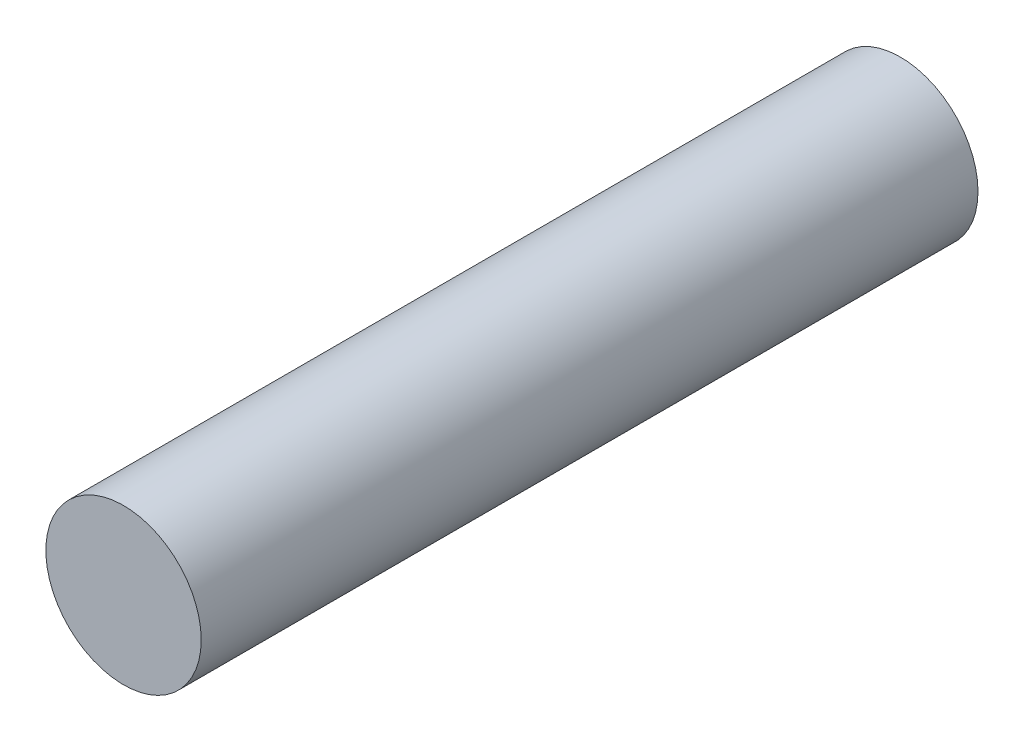
ISO-10303-21;
HEADER;
FILE_DESCRIPTION(('STEP AP214'),'2;1');
FILE_NAME('part.step','',(''),(''),'','','');
FILE_SCHEMA(('AUTOMOTIVE_DESIGN { 1 0 10303 214 1 1 1 1 }'));
ENDSEC;
DATA;
#1=APPLICATION_CONTEXT('core data for automotive mechanical design processes');
#2=APPLICATION_PROTOCOL_DEFINITION('international standard','automotive_design',2000,#1);
#3=PRODUCT_CONTEXT('',#1,'mechanical');
#4=PRODUCT('Part','Part','',(#3));
#5=PRODUCT_RELATED_PRODUCT_CATEGORY('part','',(#4));
#6=PRODUCT_DEFINITION_FORMATION('','',#4);
#7=PRODUCT_DEFINITION_CONTEXT('part definition',#1,'design');
#8=PRODUCT_DEFINITION('design','',#6,#7);
#9=PRODUCT_DEFINITION_SHAPE('','',#8);
#10=(LENGTH_UNIT() NAMED_UNIT(*) SI_UNIT(.MILLI.,.METRE.));
#11=(NAMED_UNIT(*) PLANE_ANGLE_UNIT() SI_UNIT($,.RADIAN.));
#12=(NAMED_UNIT(*) SI_UNIT($,.STERADIAN.) SOLID_ANGLE_UNIT());
#13=UNCERTAINTY_MEASURE_WITH_UNIT(LENGTH_MEASURE(1.E-05),#10,'distance_accuracy_value','');
#14=(GEOMETRIC_REPRESENTATION_CONTEXT(3) GLOBAL_UNCERTAINTY_ASSIGNED_CONTEXT((#13)) GLOBAL_UNIT_ASSIGNED_CONTEXT((#10,
#11,#12)) REPRESENTATION_CONTEXT('',''));
#15=CARTESIAN_POINT('',(0.,0.,0.));
#16=DIRECTION('',(0.,0.,1.));
#17=DIRECTION('',(1.,0.,0.));
#18=AXIS2_PLACEMENT_3D('',#15,#16,#17);
#19=CARTESIAN_POINT('',(0.,0.,0.));
#20=DIRECTION('',(0.,0.,1.));
#21=DIRECTION('',(1.,0.,0.));
#22=AXIS2_PLACEMENT_3D('',#19,#20,#21);
#23=PLANE('',#22);
#24=CARTESIAN_POINT('',(0.,0.,0.));
#25=DIRECTION('',(0.,0.,1.));
#26=DIRECTION('',(1.,0.,0.));
#27=AXIS2_PLACEMENT_3D('',#24,#25,#26);
#28=CIRCLE('',#27,3.);
#29=CARTESIAN_POINT('',(3.,0.,0.));
#30=VERTEX_POINT('',#29);
#31=EDGE_CURVE('E110',#30,#30,#28,.T.);
#32=ORIENTED_EDGE('',*,*,#31,.F.);
#33=EDGE_LOOP('',(#32));
#34=FACE_BOUND('',#33,.T.);
#35=DIRECTION('',(-0.5,-0.866025403784439,0.));
#36=VECTOR('',#35,1.);
#37=CARTESIAN_POINT('',(1.29903810567666,-0.75,0.));
#38=LINE('',#37,#36);
#39=CARTESIAN_POINT('',(1.73205080756888,0.,0.));
#40=VERTEX_POINT('',#39);
#41=CARTESIAN_POINT('',(0.866025403784439,-1.5,0.));
#42=VERTEX_POINT('',#41);
#43=EDGE_CURVE('E11',#40,#42,#38,.T.);
#44=ORIENTED_EDGE('',*,*,#43,.F.);
#45=DIRECTION('',(0.5,-0.866025403784439,0.));
#46=VECTOR('',#45,1.);
#47=CARTESIAN_POINT('',(1.29903810567666,0.75,0.));
#48=LINE('',#47,#46);
#49=CARTESIAN_POINT('',(0.866025403784439,1.5,0.));
#50=VERTEX_POINT('',#49);
#51=EDGE_CURVE('E50',#50,#40,#48,.T.);
#52=ORIENTED_EDGE('',*,*,#51,.F.);
#53=DIRECTION('',(1.,0.,0.));
#54=VECTOR('',#53,1.);
#55=CARTESIAN_POINT('',(0.,1.5,0.));
#56=LINE('',#55,#54);
#57=CARTESIAN_POINT('',(-0.866025403784438,1.5,0.));
#58=VERTEX_POINT('',#57);
#59=EDGE_CURVE('E124',#58,#50,#56,.T.);
#60=ORIENTED_EDGE('',*,*,#59,.F.);
#61=DIRECTION('',(0.5,0.866025403784438,0.));
#62=VECTOR('',#61,1.);
#63=CARTESIAN_POINT('',(-1.29903810567666,0.75,0.));
#64=LINE('',#63,#62);
#65=CARTESIAN_POINT('',(-1.73205080756888,0.,0.));
#66=VERTEX_POINT('',#65);
#67=EDGE_CURVE('E122',#66,#58,#64,.T.);
#68=ORIENTED_EDGE('',*,*,#67,.F.);
#69=DIRECTION('',(-0.5,0.866025403784439,0.));
#70=VECTOR('',#69,1.);
#71=CARTESIAN_POINT('',(-1.29903810567666,-0.75,0.));
#72=LINE('',#71,#70);
#73=CARTESIAN_POINT('',(-0.866025403784439,-1.5,0.));
#74=VERTEX_POINT('',#73);
#75=EDGE_CURVE('E121',#74,#66,#72,.T.);
#76=ORIENTED_EDGE('',*,*,#75,.F.);
#77=DIRECTION('',(-1.,0.,0.));
#78=VECTOR('',#77,1.);
#79=CARTESIAN_POINT('',(0.,-1.5,0.));
#80=LINE('',#79,#78);
#81=EDGE_CURVE('E116',#42,#74,#80,.T.);
#82=ORIENTED_EDGE('',*,*,#81,.F.);
#83=EDGE_LOOP('',(#44,#52,#60,#68,#76,#82));
#84=FACE_BOUND('',#83,.T.);
#85=ADVANCED_FACE('F39',(#34,#84),#23,.F.);
#86=CARTESIAN_POINT('',(0.,0.,30.));
#87=DIRECTION('',(0.,0.,-1.));
#88=DIRECTION('',(-1.,0.,0.));
#89=AXIS2_PLACEMENT_3D('',#86,#87,#88);
#90=CYLINDRICAL_SURFACE('',#89,3.);
#91=CARTESIAN_POINT('',(0.,0.,30.));
#92=DIRECTION('',(0.,0.,1.));
#93=DIRECTION('',(1.,0.,0.));
#94=AXIS2_PLACEMENT_3D('',#91,#92,#93);
#95=CIRCLE('',#94,3.);
#96=CARTESIAN_POINT('',(3.,0.,30.));
#97=VERTEX_POINT('',#96);
#98=EDGE_CURVE('E112',#97,#97,#95,.T.);
#99=ORIENTED_EDGE('',*,*,#98,.F.);
#100=EDGE_LOOP('',(#99));
#101=FACE_BOUND('',#100,.T.);
#102=ORIENTED_EDGE('',*,*,#31,.T.);
#103=EDGE_LOOP('',(#102));
#104=FACE_BOUND('',#103,.T.);
#105=ADVANCED_FACE('F41',(#101,#104),#90,.T.);
#106=CARTESIAN_POINT('',(0.,0.,30.));
#107=DIRECTION('',(0.,0.,1.));
#108=DIRECTION('',(1.,0.,0.));
#109=AXIS2_PLACEMENT_3D('',#106,#107,#108);
#110=PLANE('',#109);
#111=ORIENTED_EDGE('',*,*,#98,.T.);
#112=EDGE_LOOP('',(#111));
#113=FACE_BOUND('',#112,.T.);
#114=ADVANCED_FACE('F175',(#113),#110,.T.);
#115=CARTESIAN_POINT('',(0.866025403784439,-1.5,3.));
#116=DIRECTION('',(-0.866025403784439,0.5,0.));
#117=DIRECTION('',(-0.5,-0.866025403784439,0.));
#118=AXIS2_PLACEMENT_3D('',#115,#116,#117);
#119=PLANE('',#118);
#120=ORIENTED_EDGE('',*,*,#43,.T.);
#121=DIRECTION('',(0.,0.,-1.));
#122=VECTOR('',#121,1.);
#123=CARTESIAN_POINT('',(0.866025403784439,-1.5,3.));
#124=LINE('',#123,#122);
#125=CARTESIAN_POINT('',(0.866025403784439,-1.5,3.));
#126=VERTEX_POINT('',#125);
#127=EDGE_CURVE('E53',#126,#42,#124,.T.);
#128=ORIENTED_EDGE('',*,*,#127,.F.);
#129=DIRECTION('',(0.5,0.866025403784439,0.));
#130=VECTOR('',#129,1.);
#131=CARTESIAN_POINT('',(0.866025403784439,-1.5,3.));
#132=LINE('',#131,#130);
#133=CARTESIAN_POINT('',(1.73205080756888,0.,3.));
#134=VERTEX_POINT('',#133);
#135=EDGE_CURVE('E96',#126,#134,#132,.T.);
#136=ORIENTED_EDGE('',*,*,#135,.T.);
#137=DIRECTION('',(0.,0.,-1.));
#138=VECTOR('',#137,1.);
#139=CARTESIAN_POINT('',(1.73205080756888,0.,3.));
#140=LINE('',#139,#138);
#141=EDGE_CURVE('E103',#134,#40,#140,.T.);
#142=ORIENTED_EDGE('',*,*,#141,.T.);
#143=EDGE_LOOP('',(#120,#128,#136,#142));
#144=FACE_BOUND('',#143,.T.);
#145=ADVANCED_FACE('F105',(#144),#119,.T.);
#146=CARTESIAN_POINT('',(1.73205080756888,0.,3.));
#147=DIRECTION('',(-0.866025403784439,-0.5,0.));
#148=DIRECTION('',(0.5,-0.866025403784439,0.));
#149=AXIS2_PLACEMENT_3D('',#146,#147,#148);
#150=PLANE('',#149);
#151=ORIENTED_EDGE('',*,*,#51,.T.);
#152=ORIENTED_EDGE('',*,*,#141,.F.);
#153=DIRECTION('',(-0.5,0.866025403784439,0.));
#154=VECTOR('',#153,1.);
#155=CARTESIAN_POINT('',(1.73205080756888,0.,3.));
#156=LINE('',#155,#154);
#157=CARTESIAN_POINT('',(0.866025403784439,1.5,3.));
#158=VERTEX_POINT('',#157);
#159=EDGE_CURVE('E95',#134,#158,#156,.T.);
#160=ORIENTED_EDGE('',*,*,#159,.T.);
#161=DIRECTION('',(0.,0.,-1.));
#162=VECTOR('',#161,1.);
#163=CARTESIAN_POINT('',(0.866025403784439,1.5,3.));
#164=LINE('',#163,#162);
#165=EDGE_CURVE('E107',#158,#50,#164,.T.);
#166=ORIENTED_EDGE('',*,*,#165,.T.);
#167=EDGE_LOOP('',(#151,#152,#160,#166));
#168=FACE_BOUND('',#167,.T.);
#169=ADVANCED_FACE('F106',(#168),#150,.T.);
#170=CARTESIAN_POINT('',(0.866025403784439,1.5,3.));
#171=DIRECTION('',(0.,-1.,0.));
#172=DIRECTION('',(1.,0.,0.));
#173=AXIS2_PLACEMENT_3D('',#170,#171,#172);
#174=PLANE('',#173);
#175=ORIENTED_EDGE('',*,*,#59,.T.);
#176=ORIENTED_EDGE('',*,*,#165,.F.);
#177=DIRECTION('',(-1.,0.,0.));
#178=VECTOR('',#177,1.);
#179=CARTESIAN_POINT('',(0.866025403784439,1.5,3.));
#180=LINE('',#179,#178);
#181=CARTESIAN_POINT('',(-0.866025403784438,1.5,3.));
#182=VERTEX_POINT('',#181);
#183=EDGE_CURVE('E98',#158,#182,#180,.T.);
#184=ORIENTED_EDGE('',*,*,#183,.T.);
#185=DIRECTION('',(0.,0.,-1.));
#186=VECTOR('',#185,1.);
#187=CARTESIAN_POINT('',(-0.866025403784438,1.5,3.));
#188=LINE('',#187,#186);
#189=EDGE_CURVE('E114',#182,#58,#188,.T.);
#190=ORIENTED_EDGE('',*,*,#189,.T.);
#191=EDGE_LOOP('',(#175,#176,#184,#190));
#192=FACE_BOUND('',#191,.T.);
#193=ADVANCED_FACE('F129',(#192),#174,.T.);
#194=CARTESIAN_POINT('',(-0.866025403784438,1.5,3.));
#195=DIRECTION('',(0.866025403784439,-0.5,0.));
#196=DIRECTION('',(0.5,0.866025403784438,0.));
#197=AXIS2_PLACEMENT_3D('',#194,#195,#196);
#198=PLANE('',#197);
#199=ORIENTED_EDGE('',*,*,#67,.T.);
#200=ORIENTED_EDGE('',*,*,#189,.F.);
#201=DIRECTION('',(-0.5,-0.866025403784439,0.));
#202=VECTOR('',#201,1.);
#203=CARTESIAN_POINT('',(-0.866025403784438,1.5,3.));
#204=LINE('',#203,#202);
#205=CARTESIAN_POINT('',(-1.73205080756888,0.,3.));
#206=VERTEX_POINT('',#205);
#207=EDGE_CURVE('E153',#182,#206,#204,.T.);
#208=ORIENTED_EDGE('',*,*,#207,.T.);
#209=DIRECTION('',(0.,0.,-1.));
#210=VECTOR('',#209,1.);
#211=CARTESIAN_POINT('',(-1.73205080756888,0.,3.));
#212=LINE('',#211,#210);
#213=EDGE_CURVE('E144',#206,#66,#212,.T.);
#214=ORIENTED_EDGE('',*,*,#213,.T.);
#215=EDGE_LOOP('',(#199,#200,#208,#214));
#216=FACE_BOUND('',#215,.T.);
#217=ADVANCED_FACE('F156',(#216),#198,.T.);
#218=CARTESIAN_POINT('',(-1.73205080756888,0.,3.));
#219=DIRECTION('',(0.866025403784439,0.5,0.));
#220=DIRECTION('',(-0.5,0.866025403784439,0.));
#221=AXIS2_PLACEMENT_3D('',#218,#219,#220);
#222=PLANE('',#221);
#223=ORIENTED_EDGE('',*,*,#75,.T.);
#224=ORIENTED_EDGE('',*,*,#213,.F.);
#225=DIRECTION('',(0.5,-0.866025403784439,0.));
#226=VECTOR('',#225,1.);
#227=CARTESIAN_POINT('',(-1.73205080756888,0.,3.));
#228=LINE('',#227,#226);
#229=CARTESIAN_POINT('',(-0.866025403784439,-1.5,3.));
#230=VERTEX_POINT('',#229);
#231=EDGE_CURVE('E145',#206,#230,#228,.T.);
#232=ORIENTED_EDGE('',*,*,#231,.T.);
#233=DIRECTION('',(0.,0.,-1.));
#234=VECTOR('',#233,1.);
#235=CARTESIAN_POINT('',(-0.866025403784439,-1.5,3.));
#236=LINE('',#235,#234);
#237=EDGE_CURVE('E137',#230,#74,#236,.T.);
#238=ORIENTED_EDGE('',*,*,#237,.T.);
#239=EDGE_LOOP('',(#223,#224,#232,#238));
#240=FACE_BOUND('',#239,.T.);
#241=ADVANCED_FACE('F139',(#240),#222,.T.);
#242=CARTESIAN_POINT('',(-0.866025403784439,-1.5,3.));
#243=DIRECTION('',(0.,1.,0.));
#244=DIRECTION('',(-1.,0.,0.));
#245=AXIS2_PLACEMENT_3D('',#242,#243,#244);
#246=PLANE('',#245);
#247=ORIENTED_EDGE('',*,*,#81,.T.);
#248=ORIENTED_EDGE('',*,*,#237,.F.);
#249=DIRECTION('',(1.,0.,0.));
#250=VECTOR('',#249,1.);
#251=CARTESIAN_POINT('',(-0.866025403784439,-1.5,3.));
#252=LINE('',#251,#250);
#253=EDGE_CURVE('E146',#230,#126,#252,.T.);
#254=ORIENTED_EDGE('',*,*,#253,.T.);
#255=ORIENTED_EDGE('',*,*,#127,.T.);
#256=EDGE_LOOP('',(#247,#248,#254,#255));
#257=FACE_BOUND('',#256,.T.);
#258=ADVANCED_FACE('F140',(#257),#246,.T.);
#259=CARTESIAN_POINT('',(0.,0.,3.));
#260=DIRECTION('',(0.,0.,1.));
#261=DIRECTION('',(1.,0.,0.));
#262=AXIS2_PLACEMENT_3D('',#259,#260,#261);
#263=PLANE('',#262);
#264=ORIENTED_EDGE('',*,*,#135,.F.);
#265=ORIENTED_EDGE('',*,*,#253,.F.);
#266=ORIENTED_EDGE('',*,*,#231,.F.);
#267=ORIENTED_EDGE('',*,*,#207,.F.);
#268=ORIENTED_EDGE('',*,*,#183,.F.);
#269=ORIENTED_EDGE('',*,*,#159,.F.);
#270=EDGE_LOOP('',(#264,#265,#266,#267,#268,#269));
#271=FACE_BOUND('',#270,.T.);
#272=ADVANCED_FACE('F94',(#271),#263,.F.);
#273=CLOSED_SHELL('',(#85,#105,#114,#145,#169,#193,#217,#241,#258,#272));
#274=MANIFOLD_SOLID_BREP('B2',#273);
#275=ADVANCED_BREP_SHAPE_REPRESENTATION('',(#18,#274),#14);
#276=SHAPE_DEFINITION_REPRESENTATION(#9,#275);
ENDSEC;
END-ISO-10303-21;
